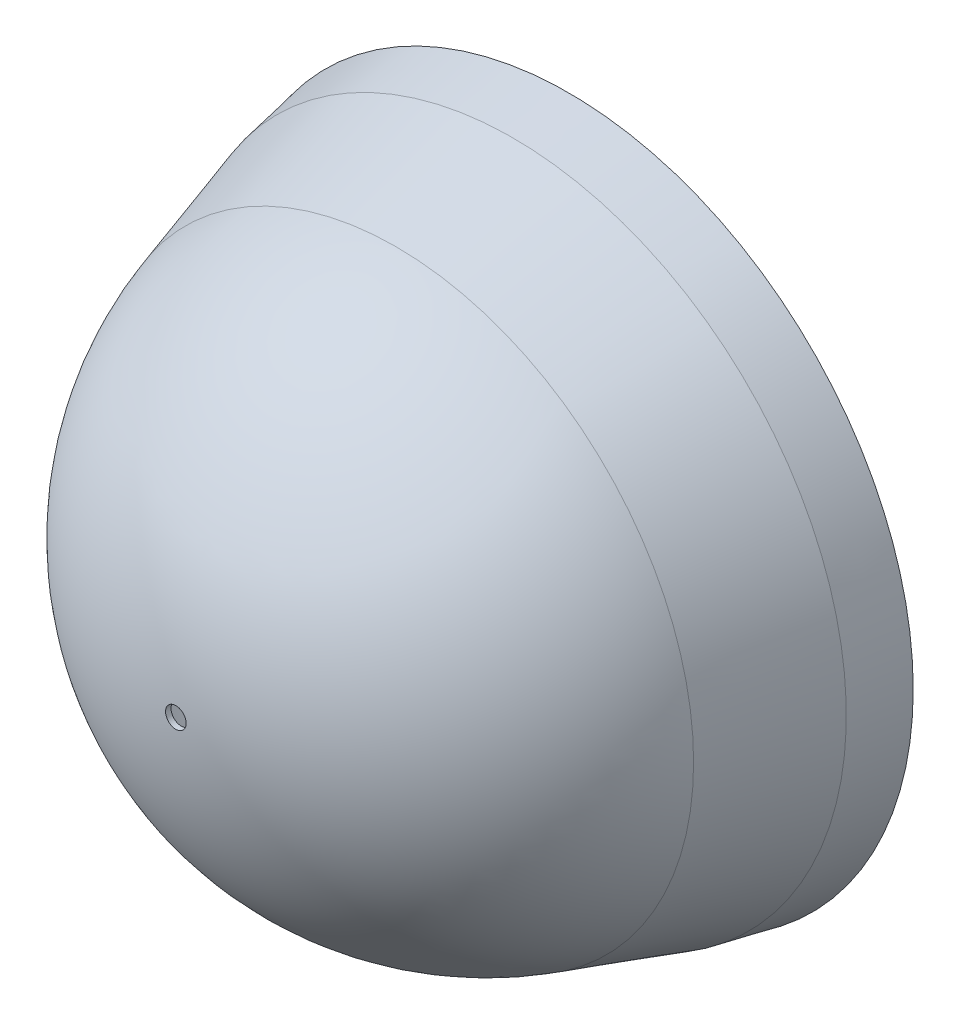
ISO-10303-21;
HEADER;
FILE_DESCRIPTION(('STEP AP214'),'2;1');
FILE_NAME('part.step','',(''),(''),'','','');
FILE_SCHEMA(('AUTOMOTIVE_DESIGN { 1 0 10303 214 1 1 1 1 }'));
ENDSEC;
DATA;
#1=APPLICATION_CONTEXT('core data for automotive mechanical design processes');
#2=APPLICATION_PROTOCOL_DEFINITION('international standard','automotive_design',2000,#1);
#3=PRODUCT_CONTEXT('',#1,'mechanical');
#4=PRODUCT('Part','Part','',(#3));
#5=PRODUCT_RELATED_PRODUCT_CATEGORY('part','',(#4));
#6=PRODUCT_DEFINITION_FORMATION('','',#4);
#7=PRODUCT_DEFINITION_CONTEXT('part definition',#1,'design');
#8=PRODUCT_DEFINITION('design','',#6,#7);
#9=PRODUCT_DEFINITION_SHAPE('','',#8);
#10=(LENGTH_UNIT() NAMED_UNIT(*) SI_UNIT(.MILLI.,.METRE.));
#11=(NAMED_UNIT(*) PLANE_ANGLE_UNIT() SI_UNIT($,.RADIAN.));
#12=(NAMED_UNIT(*) SI_UNIT($,.STERADIAN.) SOLID_ANGLE_UNIT());
#13=UNCERTAINTY_MEASURE_WITH_UNIT(LENGTH_MEASURE(1.E-05),#10,'distance_accuracy_value','');
#14=(GEOMETRIC_REPRESENTATION_CONTEXT(3) GLOBAL_UNCERTAINTY_ASSIGNED_CONTEXT((#13)) GLOBAL_UNIT_ASSIGNED_CONTEXT((#10,
#11,#12)) REPRESENTATION_CONTEXT('',''));
#15=CARTESIAN_POINT('',(0.,0.,0.));
#16=DIRECTION('',(0.,0.,1.));
#17=DIRECTION('',(1.,0.,0.));
#18=AXIS2_PLACEMENT_3D('',#15,#16,#17);
#19=CARTESIAN_POINT('',(0.,0.,-71.0184));
#20=DIRECTION('',(0.,0.,-1.));
#21=DIRECTION('',(0.,1.,0.));
#22=AXIS2_PLACEMENT_3D('',#19,#20,#21);
#23=SPHERICAL_SURFACE('',#22,71.0184);
#24=CARTESIAN_POINT('',(0.,0.,-0.040146254222384));
#25=DIRECTION('',(0.,0.,-1.));
#26=DIRECTION('',(-1.,0.,0.));
#27=AXIS2_PLACEMENT_3D('',#24,#25,#26);
#28=CIRCLE('',#27,2.3876);
#29=CARTESIAN_POINT('',(0.,2.38759999999989,-0.0401462542223702));
#30=VERTEX_POINT('',#29);
#31=EDGE_CURVE('E59',#30,#30,#28,.F.);
#32=CARTESIAN_POINT('',(0.,0.,-50.2546293253192));
#33=DIRECTION('',(0.,0.,-1.));
#34=DIRECTION('',(-1.,0.,0.));
#35=AXIS2_PLACEMENT_3D('',#32,#33,#34);
#36=CIRCLE('',#35,67.9152336808853);
#37=CARTESIAN_POINT('',(0.,67.9152336808853,-50.2546293253192));
#38=VERTEX_POINT('',#37);
#39=EDGE_CURVE('E10',#38,#38,#36,.T.);
#40=CARTESIAN_POINT('',(0.,2.38759999999989,-0.0401462542223702));
#41=CARTESIAN_POINT('',(0.,3.30474660341122,-0.0709880680638541));
#42=CARTESIAN_POINT('',(0.,4.22129395995014,-0.119625048752967));
#43=CARTESIAN_POINT('',(0.,6.05181611563421,-0.252374229208448));
#44=CARTESIAN_POINT('',(0.,6.96579091477935,-0.336486428974816));
#45=CARTESIAN_POINT('',(0.,8.78979389202688,-0.5400709329668));
#46=CARTESIAN_POINT('',(0.,9.69982207012927,-0.659543237192417));
#47=CARTESIAN_POINT('',(0.,11.5145647071342,-0.933665424844965));
#48=CARTESIAN_POINT('',(0.,12.4192791660366,-1.0883153082719));
#49=CARTESIAN_POINT('',(0.,14.2220349728322,-1.43256110164435));
#50=CARTESIAN_POINT('',(0.,15.1200763207253,-1.62215701158988));
#51=CARTESIAN_POINT('',(0.,16.908136614399,-2.03600977351559));
#52=CARTESIAN_POINT('',(0.,17.7981555601797,-2.26026662549579));
#53=CARTESIAN_POINT('',(0.,19.5688337922575,-2.7431043837108));
#54=CARTESIAN_POINT('',(0.,20.4494930785547,-3.00168528994561));
#55=CARTESIAN_POINT('',(0.,22.2001288025183,-3.55278262338902));
#56=CARTESIAN_POINT('',(0.,23.0701052401848,-3.84529905059762));
#57=CARTESIAN_POINT('',(0.,24.7980681272856,-4.46382792432586));
#58=CARTESIAN_POINT('',(0.,25.6560545767201,-4.7898403708455));
#59=CARTESIAN_POINT('',(0.,27.3587483630921,-5.47487144848983));
#60=CARTESIAN_POINT('',(0.,28.2034557000297,-5.83389007961452));
#61=CARTESIAN_POINT('',(0.,29.8783220889026,-6.58439410139816));
#62=CARTESIAN_POINT('',(0.,30.7084811408378,-6.97587949205712));
#63=CARTESIAN_POINT('',(0.,32.3530036460212,-7.79072882616403));
#64=CARTESIAN_POINT('',(0.,33.1673670992693,-8.21409276961199));
#65=CARTESIAN_POINT('',(0.,34.7790748262678,-9.09206310513865));
#66=CARTESIAN_POINT('',(0.,35.5764191000181,-9.54666949721736));
#67=CARTESIAN_POINT('',(0.,37.152890458524,-10.4864416840517));
#68=CARTESIAN_POINT('',(0.,37.9320175432794,-10.9716074788073));
#69=CARTESIAN_POINT('',(0.,39.4708838856178,-11.9717695095569));
#70=CARTESIAN_POINT('',(0.,40.2306231432007,-12.4867657455509));
#71=CARTESIAN_POINT('',(0.,41.7295723232203,-13.545814877109));
#72=CARTESIAN_POINT('',(0.,42.468782245657,-14.0898677726731));
#73=CARTESIAN_POINT('',(0.,43.9255620927294,-15.2062127840827));
#74=CARTESIAN_POINT('',(0.,44.6431320173651,-15.7785048999282));
#75=CARTESIAN_POINT('',(0.,46.0555537202701,-16.9504684831928));
#76=CARTESIAN_POINT('',(0.,46.7504054985394,-17.550139950612));
#77=CARTESIAN_POINT('',(0.,48.1163468941528,-18.7759612308502));
#78=CARTESIAN_POINT('',(0.,48.7874365114969,-19.4021110436692));
#79=CARTESIAN_POINT('',(0.,50.1048452733418,-20.6799482248276));
#80=CARTESIAN_POINT('',(0.,50.7511644178425,-21.3316355931671));
#81=CARTESIAN_POINT('',(0.,52.0180611397022,-22.6595687253211));
#82=CARTESIAN_POINT('',(0.,52.6386387170613,-23.3358144891357));
#83=CARTESIAN_POINT('',(0.,53.853119887061,-24.7118483532048));
#84=CARTESIAN_POINT('',(0.,54.4470234797017,-25.4116364534594));
#85=CARTESIAN_POINT('',(0.,55.6072643402449,-26.8337035590545));
#86=CARTESIAN_POINT('',(0.,56.1736016081472,-27.555982564395));
#87=CARTESIAN_POINT('',(0.,57.2778588979464,-29.0219462561057));
#88=CARTESIAN_POINT('',(0.,57.8157789198431,-29.7656309424758));
#89=CARTESIAN_POINT('',(0.,58.8623934919252,-31.2732886106283));
#90=CARTESIAN_POINT('',(0.,59.3710880421105,-32.0372615924106));
#91=CARTESIAN_POINT('',(0.,60.3584873613294,-33.5843479808687));
#92=CARTESIAN_POINT('',(0.,60.8371921303629,-34.3674613875444));
#93=CARTESIAN_POINT('',(0.,61.7638926187977,-35.9516520032996));
#94=CARTESIAN_POINT('',(0.,62.2118883381991,-36.7527292123792));
#95=CARTESIAN_POINT('',(0.,63.0764976689251,-38.3716437955452));
#96=CARTESIAN_POINT('',(0.,63.4931112802499,-39.1894811696317));
#97=CARTESIAN_POINT('',(0.,64.2943302278628,-40.8406873539636));
#98=CARTESIAN_POINT('',(0.,64.6789355641509,-41.674056164209));
#99=CARTESIAN_POINT('',(0.,65.4155608579427,-43.3550728175688));
#100=CARTESIAN_POINT('',(0.,65.7675808154464,-44.2027206606832));
#101=CARTESIAN_POINT('',(0.,66.4385035844042,-45.9110227854162));
#102=CARTESIAN_POINT('',(0.,66.7574063958585,-46.7716770670349));
#103=CARTESIAN_POINT('',(0.,67.3616263853133,-48.5046952180376));
#104=CARTESIAN_POINT('',(0.,67.6469435633138,-49.3770590874218));
#105=CARTESIAN_POINT('',(0.,67.9152336808853,-50.2546293253192));
#106=B_SPLINE_CURVE_WITH_KNOTS('',3,(#40,#41,#42,#43,#44,#45,#46,#47,#48,#49,#50,#51,#52,#53,
#54,#55,#56,#57,#58,#59,#60,#61,#62,#63,#64,#65,#66,#67,#68,#69,#70,#71,#72,#73,#74,#75,#76,#77,
#78,#79,#80,#81,#82,#83,#84,#85,#86,#87,#88,#89,#90,#91,#92,#93,#94,#95,#96,#97,#98,#99,#100,
#101,#102,#103,#104,#105),.UNSPECIFIED.,.F.,.F.,(4,2,2,2,2,2,2,2,2,2,2,2,2,2,2,2,2,2,2,2,2,2,2,
2,2,2,2,2,2,2,2,2,4),(0.,2.7528216450851,5.50564329017021,8.25846493525531,11.0112865803404,
13.7641082254255,16.5169298705106,19.2697515155957,22.0225731606808,24.7753948057659,
27.5282164508511,30.2810380959362,33.0338597410213,35.7866813861064,38.5395030311915,
41.2923246762766,44.0451463213617,46.7979679664468,49.5507896115319,52.303611256617,
55.0564329017021,57.8092545467872,60.5620761918723,63.3148978369574,66.0677194820425,
68.8205411271277,71.5733627722128,74.3261844172979,77.079006062383,79.8318277074681,
82.5846493525532,85.3374709976383,88.0902926427234),.UNSPECIFIED.);
#107=EDGE_CURVE('BSEAM30',#30,#38,#106,.T.);
#108=ORIENTED_EDGE('',*,*,#31,.T.);
#109=ORIENTED_EDGE('',*,*,#39,.T.);
#110=ORIENTED_EDGE('',*,*,#107,.T.);
#111=ORIENTED_EDGE('',*,*,#107,.F.);
#112=EDGE_LOOP('',(#108,#110,#109,#111));
#113=FACE_BOUND('',#112,.T.);
#114=ADVANCED_FACE('F30',(#113),#23,.F.);
#115=CARTESIAN_POINT('',(0.,0.,-77.3528789337255));
#116=DIRECTION('',(0.,0.,-1.));
#117=DIRECTION('',(-1.,0.,0.));
#118=AXIS2_PLACEMENT_3D('',#115,#116,#117);
#119=CONICAL_SURFACE('',#118,76.2,0.296705972839027);
#120=ORIENTED_EDGE('',*,*,#39,.F.);
#121=EDGE_LOOP('',(#120));
#122=FACE_BOUND('',#121,.T.);
#123=CARTESIAN_POINT('',(0.,0.,-77.3528789337255));
#124=DIRECTION('',(0.,0.,-1.));
#125=DIRECTION('',(-1.,0.,0.));
#126=AXIS2_PLACEMENT_3D('',#123,#124,#125);
#127=CIRCLE('',#126,76.2);
#128=CARTESIAN_POINT('',(-76.2,0.,-77.3528789337255));
#129=VERTEX_POINT('',#128);
#130=EDGE_CURVE('E37',#129,#129,#127,.T.);
#131=ORIENTED_EDGE('',*,*,#130,.T.);
#132=EDGE_LOOP('',(#131));
#133=FACE_BOUND('',#132,.T.);
#134=ADVANCED_FACE('F82',(#122,#133),#119,.F.);
#135=CARTESIAN_POINT('',(0.,0.,-103.700637120641));
#136=DIRECTION('',(0.,0.,-1.));
#137=DIRECTION('',(-1.,0.,0.));
#138=AXIS2_PLACEMENT_3D('',#135,#136,#137);
#139=CONICAL_SURFACE('',#138,81.3214853814583,0.19198621771937);
#140=CARTESIAN_POINT('',(0.,0.,-90.0528789337255));
#141=DIRECTION('',(0.,0.,1.));
#142=DIRECTION('',(1.,0.,0.));
#143=AXIS2_PLACEMENT_3D('',#140,#141,#142);
#144=CIRCLE('',#143,78.6686299260489);
#145=CARTESIAN_POINT('',(78.6686299260489,0.,-90.0528789337255));
#146=VERTEX_POINT('',#145);
#147=EDGE_CURVE('E42',#146,#146,#144,.F.);
#148=ORIENTED_EDGE('',*,*,#147,.T.);
#149=EDGE_LOOP('',(#148));
#150=FACE_BOUND('',#149,.T.);
#151=ORIENTED_EDGE('',*,*,#130,.F.);
#152=EDGE_LOOP('',(#151));
#153=FACE_BOUND('',#152,.T.);
#154=ADVANCED_FACE('F86',(#150,#153),#139,.F.);
#155=CARTESIAN_POINT('',(0.,79.9624001286421,-90.0528789337255));
#156=DIRECTION('',(0.,0.,1.));
#157=DIRECTION('',(1.,0.,0.));
#158=AXIS2_PLACEMENT_3D('',#155,#156,#157);
#159=PLANE('',#158);
#160=CARTESIAN_POINT('',(0.,0.,-90.0528789337255));
#161=DIRECTION('',(0.,0.,-1.));
#162=DIRECTION('',(-1.,0.,0.));
#163=AXIS2_PLACEMENT_3D('',#160,#161,#162);
#164=CIRCLE('',#163,79.9624001286421);
#165=CARTESIAN_POINT('',(-79.9624001286421,0.,-90.0528789337255));
#166=VERTEX_POINT('',#165);
#167=EDGE_CURVE('E54',#166,#166,#164,.T.);
#168=ORIENTED_EDGE('',*,*,#167,.T.);
#169=EDGE_LOOP('',(#168));
#170=FACE_BOUND('',#169,.T.);
#171=ORIENTED_EDGE('',*,*,#147,.F.);
#172=EDGE_LOOP('',(#171));
#173=FACE_BOUND('',#172,.T.);
#174=ADVANCED_FACE('F91',(#170,#173),#159,.F.);
#175=CARTESIAN_POINT('',(0.,0.,-71.0184));
#176=DIRECTION('',(0.,0.,-1.));
#177=DIRECTION('',(0.,1.,0.));
#178=AXIS2_PLACEMENT_3D('',#175,#176,#177);
#179=SPHERICAL_SURFACE('',#178,72.2883999999999);
#180=CARTESIAN_POINT('',(0.,0.,1.2305594444099));
#181=DIRECTION('',(0.,0.,-1.));
#182=DIRECTION('',(-1.,0.,0.));
#183=AXIS2_PLACEMENT_3D('',#180,#181,#182);
#184=CIRCLE('',#183,2.3876);
#185=CARTESIAN_POINT('',(0.,2.38759999999976,1.2305594444099));
#186=VERTEX_POINT('',#185);
#187=EDGE_CURVE('E33',#186,#186,#184,.T.);
#188=CARTESIAN_POINT('',(0.,0.,-49.8833172603214));
#189=DIRECTION('',(0.,0.,-1.));
#190=DIRECTION('',(-1.,0.,0.));
#191=AXIS2_PLACEMENT_3D('',#188,#189,#190);
#192=CIRCLE('',#191,69.1297407209583);
#193=CARTESIAN_POINT('',(0.,69.1297407209583,-49.8833172603213));
#194=VERTEX_POINT('',#193);
#195=EDGE_CURVE('E46',#194,#194,#192,.T.);
#196=CARTESIAN_POINT('',(0.,2.38759999999976,1.2305594444099));
#197=CARTESIAN_POINT('',(0.,3.32161080422338,1.19970312277696));
#198=CARTESIAN_POINT('',(0.,4.25502177738098,1.15071576997574));
#199=CARTESIAN_POINT('',(0.,6.11924335978512,1.01659554833492));
#200=CARTESIAN_POINT('',(0.,7.05005396903164,0.931462679495332));
#201=CARTESIAN_POINT('',(0.,8.90767412183454,0.725167972075958));
#202=CARTESIAN_POINT('',(0.,9.83448366539093,0.604006133496175));
#203=CARTESIAN_POINT('',(0.,11.6827080502503,0.325838783814121));
#204=CARTESIAN_POINT('',(0.,12.6041228915534,0.168833272711849));
#205=CARTESIAN_POINT('',(0.,14.4401720678247,-0.180786121271109));
#206=CARTESIAN_POINT('',(0.,15.3548064027929,-0.373400004151794));
#207=CARTESIAN_POINT('',(0.,17.1759190349647,-0.793946242619018));
#208=CARTESIAN_POINT('',(0.,18.0823973321682,-1.02187859820555));
#209=CARTESIAN_POINT('',(0.,19.8858346033431,-1.51271904666613));
#210=CARTESIAN_POINT('',(0.,20.7827935773145,-1.77562713954017));
#211=CARTESIAN_POINT('',(0.,22.5658432383686,-2.33602365096304));
#212=CARTESIAN_POINT('',(0.,23.4519339254515,-2.63351206951188));
#213=CARTESIAN_POINT('',(0.,25.2119143927831,-3.26262183435135));
#214=CARTESIAN_POINT('',(0.,26.085804173032,-3.59424318064199));
#215=CARTESIAN_POINT('',(0.,27.8200685564655,-4.2911200640583));
#216=CARTESIAN_POINT('',(0.,28.6804431596501,-4.65637560118398));
#217=CARTESIAN_POINT('',(0.,30.3863832445205,-5.41997154729111));
#218=CARTESIAN_POINT('',(0.,31.2319487262064,-5.81831195627257));
#219=CARTESIAN_POINT('',(0.,32.906998895576,-6.64747856934612));
#220=CARTESIAN_POINT('',(0.,33.7364835832597,-7.07830477343822));
#221=CARTESIAN_POINT('',(0.,35.378124676526,-7.97179504368313));
#222=CARTESIAN_POINT('',(0.,36.1902810821084,-8.43445910983594));
#223=CARTESIAN_POINT('',(0.,37.7960441836232,-9.39092928916295));
#224=CARTESIAN_POINT('',(0.,38.5896508795554,-9.88473540233715));
#225=CARTESIAN_POINT('',(0.,40.1571210317116,-10.9027470251716));
#226=CARTESIAN_POINT('',(0.,40.9309844879355,-11.4269525348318));
#227=CARTESIAN_POINT('',(0.,42.4578043230961,-12.5049745814928));
#228=CARTESIAN_POINT('',(0.,43.2107607020327,-13.0587911184937));
#229=CARTESIAN_POINT('',(0.,44.6946339878502,-14.1952023177362));
#230=CARTESIAN_POINT('',(0.,45.4255508947311,-14.777796979978));
#231=CARTESIAN_POINT('',(0.,46.8642459875239,-15.9708882472752));
#232=CARTESIAN_POINT('',(0.,47.5720241734357,-16.5813848523307));
#233=CARTESIAN_POINT('',(0.,48.9633773744264,-17.8293618602196));
#234=CARTESIAN_POINT('',(0.,49.6469523895053,-18.466842263053));
#235=CARTESIAN_POINT('',(0.,50.9888711988773,-19.7678281396796));
#236=CARTESIAN_POINT('',(0.,51.6472149931704,-20.4313336134726));
#237=CARTESIAN_POINT('',(0.,52.9376812570375,-21.7833717652804));
#238=CARTESIAN_POINT('',(0.,53.5698037266114,-22.471904443295));
#239=CARTESIAN_POINT('',(0.,54.8068766722073,-23.8729614975993));
#240=CARTESIAN_POINT('',(0.,55.4118271482292,-24.5854858738889));
#241=CARTESIAN_POINT('',(0.,56.5936463026056,-26.0334547369617));
#242=CARTESIAN_POINT('',(0.,57.1705149809599,-26.7688992237449));
#243=CARTESIAN_POINT('',(0.,58.2953029693501,-28.2616022496208));
#244=CARTESIAN_POINT('',(0.,58.843222279386,-29.0188607887135));
#245=CARTESIAN_POINT('',(0.,59.9092874969858,-30.5540530546623));
#246=CARTESIAN_POINT('',(0.,60.4274334045499,-31.3319867815184));
#247=CARTESIAN_POINT('',(0.,61.4331725653122,-32.9073594626036));
#248=CARTESIAN_POINT('',(0.,61.9207658185104,-33.7047984168327));
#249=CARTESIAN_POINT('',(0.,62.8646663486985,-35.3179822643895));
#250=CARTESIAN_POINT('',(0.,63.3209736256883,-36.1337271577174));
#251=CARTESIAN_POINT('',(0.,64.2016160046607,-37.7822960395365));
#252=CARTESIAN_POINT('',(0.,64.6259511066433,-38.6151200280278));
#253=CARTESIAN_POINT('',(0.,65.4420107554845,-40.2965946629446));
#254=CARTESIAN_POINT('',(0.,65.8337353023431,-41.1452453093701));
#255=CARTESIAN_POINT('',(0.,66.5839854948863,-42.8570966755252));
#256=CARTESIAN_POINT('',(0.,66.9425111405711,-43.7202973952547));
#257=CARTESIAN_POINT('',(0.,67.6258214187528,-45.4599517293509));
#258=CARTESIAN_POINT('',(0.,67.9506060512499,-46.3364053437177));
#259=CARTESIAN_POINT('',(0.,68.5659567245256,-48.101243549065));
#260=CARTESIAN_POINT('',(0.,68.8565227653042,-48.9896281400456));
#261=CARTESIAN_POINT('',(0.,69.1297407209583,-49.8833172603214));
#262=B_SPLINE_CURVE_WITH_KNOTS('',3,(#196,#197,#198,#199,#200,#201,#202,#203,#204,#205,#206,
#207,#208,#209,#210,#211,#212,#213,#214,#215,#216,#217,#218,#219,#220,#221,#222,#223,#224,#225,
#226,#227,#228,#229,#230,#231,#232,#233,#234,#235,#236,#237,#238,#239,#240,#241,#242,#243,#244,
#245,#246,#247,#248,#249,#250,#251,#252,#253,#254,#255,#256,#257,#258,#259,#260,#261),
.UNSPECIFIED.,.F.,.F.,(4,2,2,2,2,2,2,2,2,2,2,2,2,2,2,2,2,2,2,2,2,2,2,2,2,2,2,2,2,2,2,2,4),(0.,
2.80338426275826,5.60676852551652,8.41015278827477,11.213537051033,14.0169213137913,
16.8203055765495,19.6236898393078,22.4270741020661,25.2304583648243,28.0338426275826,
30.8372268903409,33.6406111530991,36.4439954158574,39.2473796786156,42.0507639413739,
44.8541482041322,47.6575324668904,50.4609167296487,53.2643009924069,56.0676852551652,
58.8710695179235,61.6744537806817,64.47783804344,67.2812223061982,70.0846065689565,
72.8879908317147,75.691375094473,78.4947593572313,81.2981436199895,84.1015278827478,
86.904912145506,89.7082964082643),.UNSPECIFIED.);
#263=EDGE_CURVE('BSEAM66',#186,#194,#262,.T.);
#264=ORIENTED_EDGE('',*,*,#187,.T.);
#265=ORIENTED_EDGE('',*,*,#195,.F.);
#266=ORIENTED_EDGE('',*,*,#263,.T.);
#267=ORIENTED_EDGE('',*,*,#263,.F.);
#268=EDGE_LOOP('',(#264,#266,#265,#267));
#269=FACE_BOUND('',#268,.T.);
#270=ADVANCED_FACE('F66',(#269),#179,.T.);
#271=CARTESIAN_POINT('',(0.,0.,-49.8833172603214));
#272=DIRECTION('',(0.,0.,-1.));
#273=DIRECTION('',(-1.,0.,0.));
#274=AXIS2_PLACEMENT_3D('',#271,#272,#273);
#275=CONICAL_SURFACE('',#274,69.1297407209583,0.296705972839029);
#276=CARTESIAN_POINT('',(0.,0.,-77.0452164856215));
#277=DIRECTION('',(0.,0.,-1.));
#278=DIRECTION('',(-1.,0.,0.));
#279=AXIS2_PLACEMENT_3D('',#276,#277,#278);
#280=CIRCLE('',#279,77.4339666808206);
#281=CARTESIAN_POINT('',(-77.4339666808206,0.,-77.0452164856215));
#282=VERTEX_POINT('',#281);
#283=EDGE_CURVE('E50',#282,#282,#280,.T.);
#284=ORIENTED_EDGE('',*,*,#283,.F.);
#285=EDGE_LOOP('',(#284));
#286=FACE_BOUND('',#285,.T.);
#287=ORIENTED_EDGE('',*,*,#195,.T.);
#288=EDGE_LOOP('',(#287));
#289=FACE_BOUND('',#288,.T.);
#290=ADVANCED_FACE('F77',(#286,#289),#275,.T.);
#291=CARTESIAN_POINT('',(0.,0.,-77.0452164856215));
#292=DIRECTION('',(0.,0.,-1.));
#293=DIRECTION('',(-1.,0.,0.));
#294=AXIS2_PLACEMENT_3D('',#291,#292,#293);
#295=CONICAL_SURFACE('',#294,77.4339666808206,0.191986217719369);
#296=ORIENTED_EDGE('',*,*,#167,.F.);
#297=EDGE_LOOP('',(#296));
#298=FACE_BOUND('',#297,.T.);
#299=ORIENTED_EDGE('',*,*,#283,.T.);
#300=EDGE_LOOP('',(#299));
#301=FACE_BOUND('',#300,.T.);
#302=ADVANCED_FACE('F72',(#298,#301),#295,.T.);
#303=CARTESIAN_POINT('',(0.,0.,-12.7));
#304=DIRECTION('',(0.,0.,1.));
#305=DIRECTION('',(1.,0.,0.));
#306=AXIS2_PLACEMENT_3D('',#303,#304,#305);
#307=CYLINDRICAL_SURFACE('',#306,2.3876);
#308=ORIENTED_EDGE('',*,*,#187,.F.);
#309=EDGE_LOOP('',(#308));
#310=FACE_BOUND('',#309,.T.);
#311=ORIENTED_EDGE('',*,*,#31,.F.);
#312=EDGE_LOOP('',(#311));
#313=FACE_BOUND('',#312,.T.);
#314=ADVANCED_FACE('F69',(#310,#313),#307,.F.);
#315=CLOSED_SHELL('',(#114,#134,#154,#174,#270,#290,#302,#314));
#316=MANIFOLD_SOLID_BREP('B2',#315);
#317=ADVANCED_BREP_SHAPE_REPRESENTATION('',(#18,#316),#14);
#318=SHAPE_DEFINITION_REPRESENTATION(#9,#317);
ENDSEC;
END-ISO-10303-21;
